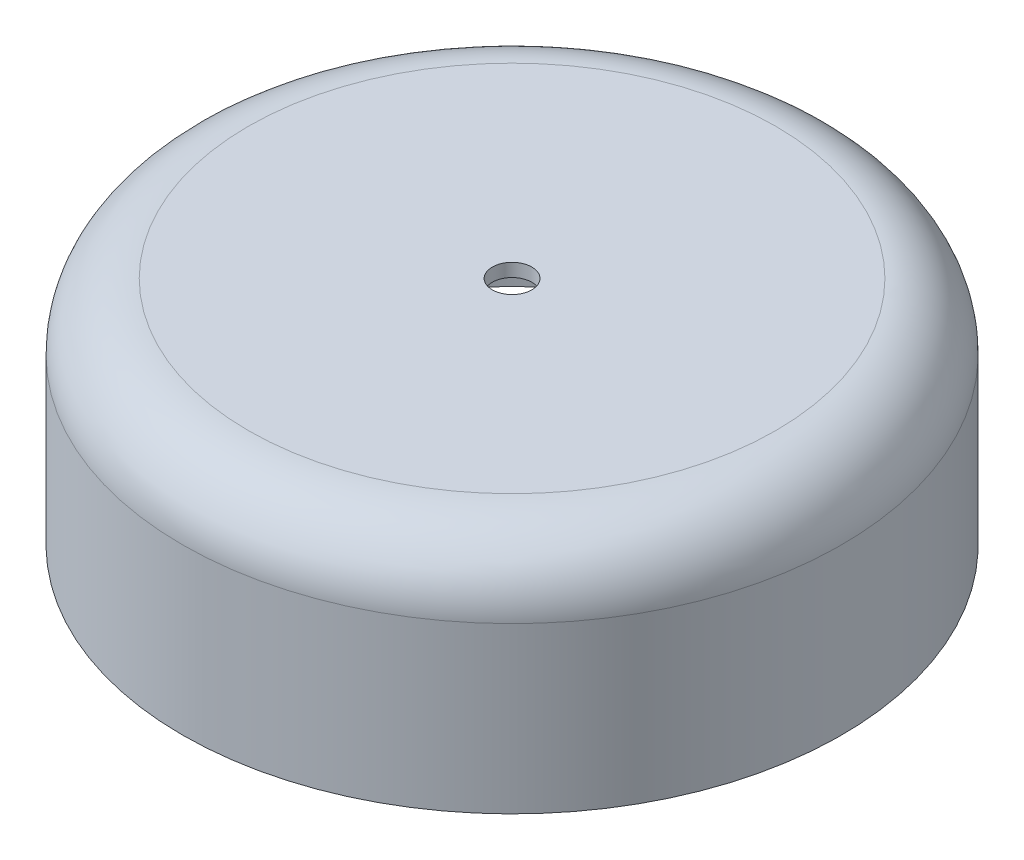
ISO-10303-21;
HEADER;
FILE_DESCRIPTION(('STEP AP214'),'2;1');
FILE_NAME('part.step','',(''),(''),'','','');
FILE_SCHEMA(('AUTOMOTIVE_DESIGN { 1 0 10303 214 1 1 1 1 }'));
ENDSEC;
DATA;
#1=APPLICATION_CONTEXT('core data for automotive mechanical design processes');
#2=APPLICATION_PROTOCOL_DEFINITION('international standard','automotive_design',2000,#1);
#3=PRODUCT_CONTEXT('',#1,'mechanical');
#4=PRODUCT('Part','Part','',(#3));
#5=PRODUCT_RELATED_PRODUCT_CATEGORY('part','',(#4));
#6=PRODUCT_DEFINITION_FORMATION('','',#4);
#7=PRODUCT_DEFINITION_CONTEXT('part definition',#1,'design');
#8=PRODUCT_DEFINITION('design','',#6,#7);
#9=PRODUCT_DEFINITION_SHAPE('','',#8);
#10=(LENGTH_UNIT() NAMED_UNIT(*) SI_UNIT(.MILLI.,.METRE.));
#11=(NAMED_UNIT(*) PLANE_ANGLE_UNIT() SI_UNIT($,.RADIAN.));
#12=(NAMED_UNIT(*) SI_UNIT($,.STERADIAN.) SOLID_ANGLE_UNIT());
#13=UNCERTAINTY_MEASURE_WITH_UNIT(LENGTH_MEASURE(1.E-05),#10,'distance_accuracy_value','');
#14=(GEOMETRIC_REPRESENTATION_CONTEXT(3) GLOBAL_UNCERTAINTY_ASSIGNED_CONTEXT((#13)) GLOBAL_UNIT_ASSIGNED_CONTEXT((#10,
#11,#12)) REPRESENTATION_CONTEXT('',''));
#15=CARTESIAN_POINT('',(0.,0.,0.));
#16=DIRECTION('',(0.,0.,1.));
#17=DIRECTION('',(1.,0.,0.));
#18=AXIS2_PLACEMENT_3D('',#15,#16,#17);
#19=CARTESIAN_POINT('',(0.,33.,-7.50267629332377));
#20=DIRECTION('',(0.,1.,0.));
#21=DIRECTION('',(0.,0.,1.));
#22=AXIS2_PLACEMENT_3D('',#19,#20,#21);
#23=PLANE('',#22);
#24=CARTESIAN_POINT('',(0.,33.,-7.50267629332377));
#25=DIRECTION('',(0.,1.,0.));
#26=DIRECTION('',(0.,0.,1.));
#27=AXIS2_PLACEMENT_3D('',#24,#25,#26);
#28=CIRCLE('',#27,3.);
#29=CARTESIAN_POINT('',(0.,33.,-4.50267629332377));
#30=VERTEX_POINT('',#29);
#31=EDGE_CURVE('E136',#30,#30,#28,.T.);
#32=ORIENTED_EDGE('',*,*,#31,.T.);
#33=EDGE_LOOP('',(#32));
#34=FACE_BOUND('',#33,.T.);
#35=DIRECTION('',(0.,0.,-1.));
#36=VECTOR('',#35,1.);
#37=CARTESIAN_POINT('',(-6.00000000000001,33.,6.));
#38=LINE('',#37,#36);
#39=CARTESIAN_POINT('',(-6.00000000000001,33.,10.5));
#40=VERTEX_POINT('',#39);
#41=CARTESIAN_POINT('',(-6.00000000000001,33.,6.));
#42=VERTEX_POINT('',#41);
#43=EDGE_CURVE('E159',#40,#42,#38,.T.);
#44=ORIENTED_EDGE('',*,*,#43,.F.);
#45=DIRECTION('',(-1.,0.,0.));
#46=VECTOR('',#45,1.);
#47=CARTESIAN_POINT('',(5.99999999999999,33.,10.5));
#48=LINE('',#47,#46);
#49=CARTESIAN_POINT('',(5.99999999999999,33.,10.5));
#50=VERTEX_POINT('',#49);
#51=EDGE_CURVE('E147',#50,#40,#48,.T.);
#52=ORIENTED_EDGE('',*,*,#51,.F.);
#53=DIRECTION('',(0.,0.,1.));
#54=VECTOR('',#53,1.);
#55=CARTESIAN_POINT('',(5.99999999999999,33.,6.));
#56=LINE('',#55,#54);
#57=CARTESIAN_POINT('',(5.99999999999999,33.,6.));
#58=VERTEX_POINT('',#57);
#59=EDGE_CURVE('E153',#58,#50,#56,.T.);
#60=ORIENTED_EDGE('',*,*,#59,.F.);
#61=DIRECTION('',(1.,0.,0.));
#62=VECTOR('',#61,1.);
#63=CARTESIAN_POINT('',(5.99999999999999,33.,6.));
#64=LINE('',#63,#62);
#65=EDGE_CURVE('E160',#42,#58,#64,.T.);
#66=ORIENTED_EDGE('',*,*,#65,.F.);
#67=EDGE_LOOP('',(#44,#52,#60,#66));
#68=FACE_BOUND('',#67,.T.);
#69=CARTESIAN_POINT('',(0.,33.,-7.50267629332377));
#70=DIRECTION('',(0.,1.,0.));
#71=DIRECTION('',(0.,0.,1.));
#72=AXIS2_PLACEMENT_3D('',#69,#70,#71);
#73=CIRCLE('',#72,40.);
#74=CARTESIAN_POINT('',(0.,33.,32.4973237066762));
#75=VERTEX_POINT('',#74);
#76=EDGE_CURVE('E128',#75,#75,#73,.T.);
#77=ORIENTED_EDGE('',*,*,#76,.F.);
#78=EDGE_LOOP('',(#77));
#79=FACE_BOUND('',#78,.T.);
#80=DIRECTION('',(0.,0.,-1.));
#81=VECTOR('',#80,1.);
#82=CARTESIAN_POINT('',(-5.99999999999999,33.,-21.5));
#83=LINE('',#82,#81);
#84=CARTESIAN_POINT('',(-6.,33.,-17.));
#85=VERTEX_POINT('',#84);
#86=CARTESIAN_POINT('',(-5.99999999999999,33.,-21.5));
#87=VERTEX_POINT('',#86);
#88=EDGE_CURVE('E127',#85,#87,#83,.T.);
#89=ORIENTED_EDGE('',*,*,#88,.F.);
#90=DIRECTION('',(-1.,0.,0.));
#91=VECTOR('',#90,1.);
#92=CARTESIAN_POINT('',(6.,33.,-17.));
#93=LINE('',#92,#91);
#94=CARTESIAN_POINT('',(6.,33.,-17.));
#95=VERTEX_POINT('',#94);
#96=EDGE_CURVE('E123',#95,#85,#93,.T.);
#97=ORIENTED_EDGE('',*,*,#96,.F.);
#98=DIRECTION('',(0.,0.,1.));
#99=VECTOR('',#98,1.);
#100=CARTESIAN_POINT('',(6.00000000000001,33.,-21.5));
#101=LINE('',#100,#99);
#102=CARTESIAN_POINT('',(6.00000000000001,33.,-21.5));
#103=VERTEX_POINT('',#102);
#104=EDGE_CURVE('E64',#103,#95,#101,.T.);
#105=ORIENTED_EDGE('',*,*,#104,.F.);
#106=DIRECTION('',(1.,0.,0.));
#107=VECTOR('',#106,1.);
#108=CARTESIAN_POINT('',(6.00000000000001,33.,-21.5));
#109=LINE('',#108,#107);
#110=EDGE_CURVE('E57',#87,#103,#109,.T.);
#111=ORIENTED_EDGE('',*,*,#110,.F.);
#112=EDGE_LOOP('',(#89,#97,#105,#111));
#113=FACE_BOUND('',#112,.T.);
#114=ADVANCED_FACE('F41',(#34,#68,#79,#113),#23,.F.);
#115=CARTESIAN_POINT('',(0.,35.,-7.50267629332377));
#116=DIRECTION('',(0.,-1.,0.));
#117=DIRECTION('',(0.,0.,-1.));
#118=AXIS2_PLACEMENT_3D('',#115,#116,#117);
#119=CYLINDRICAL_SURFACE('',#118,50.);
#120=CARTESIAN_POINT('',(0.,25.,-7.50267629332377));
#121=DIRECTION('',(0.,1.,0.));
#122=DIRECTION('',(0.,0.,1.));
#123=AXIS2_PLACEMENT_3D('',#120,#121,#122);
#124=CIRCLE('',#123,50.);
#125=CARTESIAN_POINT('',(0.,25.,42.4973237066762));
#126=VERTEX_POINT('',#125);
#127=EDGE_CURVE('E11',#126,#126,#124,.F.);
#128=ORIENTED_EDGE('',*,*,#127,.T.);
#129=EDGE_LOOP('',(#128));
#130=FACE_BOUND('',#129,.T.);
#131=CARTESIAN_POINT('',(0.,0.,-7.50267629332377));
#132=DIRECTION('',(0.,1.,0.));
#133=DIRECTION('',(0.,0.,1.));
#134=AXIS2_PLACEMENT_3D('',#131,#132,#133);
#135=CIRCLE('',#134,50.);
#136=CARTESIAN_POINT('',(0.,0.,42.4973237066762));
#137=VERTEX_POINT('',#136);
#138=EDGE_CURVE('E175',#137,#137,#135,.T.);
#139=ORIENTED_EDGE('',*,*,#138,.T.);
#140=EDGE_LOOP('',(#139));
#141=FACE_BOUND('',#140,.T.);
#142=ADVANCED_FACE('F196',(#130,#141),#119,.T.);
#143=CARTESIAN_POINT('',(0.,35.,-7.50267629332377));
#144=DIRECTION('',(0.,1.,0.));
#145=DIRECTION('',(0.,0.,1.));
#146=AXIS2_PLACEMENT_3D('',#143,#144,#145);
#147=PLANE('',#146);
#148=CARTESIAN_POINT('',(0.,35.,-7.50267629332377));
#149=DIRECTION('',(0.,1.,0.));
#150=DIRECTION('',(0.,0.,1.));
#151=AXIS2_PLACEMENT_3D('',#148,#149,#150);
#152=CIRCLE('',#151,3.);
#153=CARTESIAN_POINT('',(0.,35.,-4.50267629332377));
#154=VERTEX_POINT('',#153);
#155=EDGE_CURVE('E222',#154,#154,#152,.T.);
#156=ORIENTED_EDGE('',*,*,#155,.F.);
#157=EDGE_LOOP('',(#156));
#158=FACE_BOUND('',#157,.T.);
#159=CARTESIAN_POINT('',(0.,35.,-7.50267629332377));
#160=DIRECTION('',(0.,1.,0.));
#161=DIRECTION('',(0.,0.,1.));
#162=AXIS2_PLACEMENT_3D('',#159,#160,#161);
#163=CIRCLE('',#162,40.);
#164=CARTESIAN_POINT('',(0.,35.,32.4973237066762));
#165=VERTEX_POINT('',#164);
#166=EDGE_CURVE('E47',#165,#165,#163,.T.);
#167=ORIENTED_EDGE('',*,*,#166,.T.);
#168=EDGE_LOOP('',(#167));
#169=FACE_BOUND('',#168,.T.);
#170=ADVANCED_FACE('F179',(#158,#169),#147,.T.);
#171=CARTESIAN_POINT('',(0.,0.,-7.50267629332377));
#172=DIRECTION('',(0.,1.,0.));
#173=DIRECTION('',(0.,0.,1.));
#174=AXIS2_PLACEMENT_3D('',#171,#172,#173);
#175=PLANE('',#174);
#176=CARTESIAN_POINT('',(0.,0.,-7.50267629332377));
#177=DIRECTION('',(0.,1.,0.));
#178=DIRECTION('',(0.,0.,1.));
#179=AXIS2_PLACEMENT_3D('',#176,#177,#178);
#180=CIRCLE('',#179,48.);
#181=CARTESIAN_POINT('',(0.,0.,40.4973237066762));
#182=VERTEX_POINT('',#181);
#183=EDGE_CURVE('E130',#182,#182,#180,.T.);
#184=ORIENTED_EDGE('',*,*,#183,.T.);
#185=EDGE_LOOP('',(#184));
#186=FACE_BOUND('',#185,.T.);
#187=ORIENTED_EDGE('',*,*,#138,.F.);
#188=EDGE_LOOP('',(#187));
#189=FACE_BOUND('',#188,.T.);
#190=ADVANCED_FACE('F184',(#186,#189),#175,.F.);
#191=CARTESIAN_POINT('',(0.,25.,-7.50267629332377));
#192=DIRECTION('',(0.,1.,0.));
#193=DIRECTION('',(0.,0.,1.));
#194=AXIS2_PLACEMENT_3D('',#191,#192,#193);
#195=TOROIDAL_SURFACE('',#194,40.,10.);
#196=ORIENTED_EDGE('',*,*,#127,.F.);
#197=EDGE_LOOP('',(#196));
#198=FACE_BOUND('',#197,.T.);
#199=ORIENTED_EDGE('',*,*,#166,.F.);
#200=EDGE_LOOP('',(#199));
#201=FACE_BOUND('',#200,.T.);
#202=ADVANCED_FACE('F43',(#198,#201),#195,.T.);
#203=CARTESIAN_POINT('',(0.,35.,-7.50267629332377));
#204=DIRECTION('',(0.,-1.,0.));
#205=DIRECTION('',(0.,0.,-1.));
#206=AXIS2_PLACEMENT_3D('',#203,#204,#205);
#207=CYLINDRICAL_SURFACE('',#206,48.);
#208=CARTESIAN_POINT('',(0.,25.,-7.50267629332377));
#209=DIRECTION('',(0.,-1.,0.));
#210=DIRECTION('',(0.,0.,-1.));
#211=AXIS2_PLACEMENT_3D('',#208,#209,#210);
#212=CIRCLE('',#211,48.);
#213=CARTESIAN_POINT('',(0.,25.,-55.5026762933238));
#214=VERTEX_POINT('',#213);
#215=EDGE_CURVE('E168',#214,#214,#212,.T.);
#216=ORIENTED_EDGE('',*,*,#215,.F.);
#217=EDGE_LOOP('',(#216));
#218=FACE_BOUND('',#217,.T.);
#219=ORIENTED_EDGE('',*,*,#183,.F.);
#220=EDGE_LOOP('',(#219));
#221=FACE_BOUND('',#220,.T.);
#222=ADVANCED_FACE('F181',(#218,#221),#207,.F.);
#223=CARTESIAN_POINT('',(0.,25.,-7.50267629332377));
#224=DIRECTION('',(0.,1.,0.));
#225=DIRECTION('',(0.,0.,1.));
#226=AXIS2_PLACEMENT_3D('',#223,#224,#225);
#227=TOROIDAL_SURFACE('',#226,40.,8.);
#228=ORIENTED_EDGE('',*,*,#215,.T.);
#229=EDGE_LOOP('',(#228));
#230=FACE_BOUND('',#229,.T.);
#231=ORIENTED_EDGE('',*,*,#76,.T.);
#232=EDGE_LOOP('',(#231));
#233=FACE_BOUND('',#232,.T.);
#234=ADVANCED_FACE('F192',(#230,#233),#227,.F.);
#235=CARTESIAN_POINT('',(-6.00000000000001,26.5,6.));
#236=DIRECTION('',(1.,0.,0.));
#237=DIRECTION('',(0.,0.,-1.));
#238=AXIS2_PLACEMENT_3D('',#235,#236,#237);
#239=PLANE('',#238);
#240=ORIENTED_EDGE('',*,*,#43,.T.);
#241=DIRECTION('',(0.,1.,0.));
#242=VECTOR('',#241,1.);
#243=CARTESIAN_POINT('',(-6.00000000000001,26.5,6.));
#244=LINE('',#243,#242);
#245=CARTESIAN_POINT('',(-6.00000000000001,26.5,6.));
#246=VERTEX_POINT('',#245);
#247=EDGE_CURVE('E137',#246,#42,#244,.T.);
#248=ORIENTED_EDGE('',*,*,#247,.F.);
#249=DIRECTION('',(0.,0.,-1.));
#250=VECTOR('',#249,1.);
#251=CARTESIAN_POINT('',(-6.00000000000001,26.5,6.));
#252=LINE('',#251,#250);
#253=CARTESIAN_POINT('',(-6.00000000000001,26.5,10.5));
#254=VERTEX_POINT('',#253);
#255=EDGE_CURVE('E152',#254,#246,#252,.T.);
#256=ORIENTED_EDGE('',*,*,#255,.F.);
#257=DIRECTION('',(0.,1.,0.));
#258=VECTOR('',#257,1.);
#259=CARTESIAN_POINT('',(-6.00000000000001,26.5,10.5));
#260=LINE('',#259,#258);
#261=EDGE_CURVE('E148',#254,#40,#260,.T.);
#262=ORIENTED_EDGE('',*,*,#261,.T.);
#263=EDGE_LOOP('',(#240,#248,#256,#262));
#264=FACE_BOUND('',#263,.T.);
#265=ADVANCED_FACE('F213',(#264),#239,.F.);
#266=CARTESIAN_POINT('',(5.99999999999999,26.5,6.));
#267=DIRECTION('',(0.,0.,1.));
#268=DIRECTION('',(1.,0.,0.));
#269=AXIS2_PLACEMENT_3D('',#266,#267,#268);
#270=PLANE('',#269);
#271=ORIENTED_EDGE('',*,*,#65,.T.);
#272=DIRECTION('',(0.,1.,0.));
#273=VECTOR('',#272,1.);
#274=CARTESIAN_POINT('',(5.99999999999999,26.5,6.));
#275=LINE('',#274,#273);
#276=CARTESIAN_POINT('',(5.99999999999999,26.5,6.));
#277=VERTEX_POINT('',#276);
#278=EDGE_CURVE('E139',#277,#58,#275,.T.);
#279=ORIENTED_EDGE('',*,*,#278,.F.);
#280=DIRECTION('',(1.,0.,0.));
#281=VECTOR('',#280,1.);
#282=CARTESIAN_POINT('',(5.99999999999999,26.5,6.));
#283=LINE('',#282,#281);
#284=EDGE_CURVE('E167',#246,#277,#283,.T.);
#285=ORIENTED_EDGE('',*,*,#284,.F.);
#286=ORIENTED_EDGE('',*,*,#247,.T.);
#287=EDGE_LOOP('',(#271,#279,#285,#286));
#288=FACE_BOUND('',#287,.T.);
#289=ADVANCED_FACE('F254',(#288),#270,.F.);
#290=CARTESIAN_POINT('',(5.99999999999999,26.5,6.));
#291=DIRECTION('',(-1.,0.,0.));
#292=DIRECTION('',(0.,0.,1.));
#293=AXIS2_PLACEMENT_3D('',#290,#291,#292);
#294=PLANE('',#293);
#295=ORIENTED_EDGE('',*,*,#59,.T.);
#296=DIRECTION('',(0.,1.,0.));
#297=VECTOR('',#296,1.);
#298=CARTESIAN_POINT('',(5.99999999999999,26.5,10.5));
#299=LINE('',#298,#297);
#300=CARTESIAN_POINT('',(5.99999999999999,26.5,10.5));
#301=VERTEX_POINT('',#300);
#302=EDGE_CURVE('E141',#301,#50,#299,.T.);
#303=ORIENTED_EDGE('',*,*,#302,.F.);
#304=DIRECTION('',(0.,0.,1.));
#305=VECTOR('',#304,1.);
#306=CARTESIAN_POINT('',(5.99999999999999,26.5,6.));
#307=LINE('',#306,#305);
#308=EDGE_CURVE('E163',#277,#301,#307,.T.);
#309=ORIENTED_EDGE('',*,*,#308,.F.);
#310=ORIENTED_EDGE('',*,*,#278,.T.);
#311=EDGE_LOOP('',(#295,#303,#309,#310));
#312=FACE_BOUND('',#311,.T.);
#313=ADVANCED_FACE('F259',(#312),#294,.F.);
#314=CARTESIAN_POINT('',(5.99999999999999,26.5,10.5));
#315=DIRECTION('',(0.,0.,-1.));
#316=DIRECTION('',(-1.,0.,0.));
#317=AXIS2_PLACEMENT_3D('',#314,#315,#316);
#318=PLANE('',#317);
#319=ORIENTED_EDGE('',*,*,#51,.T.);
#320=ORIENTED_EDGE('',*,*,#261,.F.);
#321=DIRECTION('',(-1.,0.,0.));
#322=VECTOR('',#321,1.);
#323=CARTESIAN_POINT('',(5.99999999999999,26.5,10.5));
#324=LINE('',#323,#322);
#325=EDGE_CURVE('E149',#301,#254,#324,.T.);
#326=ORIENTED_EDGE('',*,*,#325,.F.);
#327=ORIENTED_EDGE('',*,*,#302,.T.);
#328=EDGE_LOOP('',(#319,#320,#326,#327));
#329=FACE_BOUND('',#328,.T.);
#330=ADVANCED_FACE('F263',(#329),#318,.F.);
#331=CARTESIAN_POINT('',(0.,26.5,0.));
#332=DIRECTION('',(0.,-1.,0.));
#333=DIRECTION('',(0.,0.,-1.));
#334=AXIS2_PLACEMENT_3D('',#331,#332,#333);
#335=PLANE('',#334);
#336=ORIENTED_EDGE('',*,*,#255,.T.);
#337=ORIENTED_EDGE('',*,*,#284,.T.);
#338=ORIENTED_EDGE('',*,*,#308,.T.);
#339=ORIENTED_EDGE('',*,*,#325,.T.);
#340=EDGE_LOOP('',(#336,#337,#338,#339));
#341=FACE_BOUND('',#340,.T.);
#342=ADVANCED_FACE('F252',(#341),#335,.T.);
#343=CARTESIAN_POINT('',(-5.99999999999999,26.5,-21.5));
#344=DIRECTION('',(1.,0.,0.));
#345=DIRECTION('',(0.,0.,-1.));
#346=AXIS2_PLACEMENT_3D('',#343,#344,#345);
#347=PLANE('',#346);
#348=ORIENTED_EDGE('',*,*,#88,.T.);
#349=DIRECTION('',(0.,1.,0.));
#350=VECTOR('',#349,1.);
#351=CARTESIAN_POINT('',(-5.99999999999999,26.5,-21.5));
#352=LINE('',#351,#350);
#353=CARTESIAN_POINT('',(-5.99999999999999,26.5,-21.5));
#354=VERTEX_POINT('',#353);
#355=EDGE_CURVE('E110',#354,#87,#352,.T.);
#356=ORIENTED_EDGE('',*,*,#355,.F.);
#357=DIRECTION('',(0.,0.,-1.));
#358=VECTOR('',#357,1.);
#359=CARTESIAN_POINT('',(-5.99999999999999,26.5,-21.5));
#360=LINE('',#359,#358);
#361=CARTESIAN_POINT('',(-6.,26.5,-17.));
#362=VERTEX_POINT('',#361);
#363=EDGE_CURVE('E111',#362,#354,#360,.T.);
#364=ORIENTED_EDGE('',*,*,#363,.F.);
#365=DIRECTION('',(0.,1.,0.));
#366=VECTOR('',#365,1.);
#367=CARTESIAN_POINT('',(-6.,26.5,-17.));
#368=LINE('',#367,#366);
#369=EDGE_CURVE('E230',#362,#85,#368,.T.);
#370=ORIENTED_EDGE('',*,*,#369,.T.);
#371=EDGE_LOOP('',(#348,#356,#364,#370));
#372=FACE_BOUND('',#371,.T.);
#373=ADVANCED_FACE('F124',(#372),#347,.F.);
#374=CARTESIAN_POINT('',(6.00000000000001,26.5,-21.5));
#375=DIRECTION('',(0.,0.,1.));
#376=DIRECTION('',(1.,0.,0.));
#377=AXIS2_PLACEMENT_3D('',#374,#375,#376);
#378=PLANE('',#377);
#379=ORIENTED_EDGE('',*,*,#110,.T.);
#380=DIRECTION('',(0.,1.,0.));
#381=VECTOR('',#380,1.);
#382=CARTESIAN_POINT('',(6.00000000000001,26.5,-21.5));
#383=LINE('',#382,#381);
#384=CARTESIAN_POINT('',(6.00000000000001,26.5,-21.5));
#385=VERTEX_POINT('',#384);
#386=EDGE_CURVE('E109',#385,#103,#383,.T.);
#387=ORIENTED_EDGE('',*,*,#386,.F.);
#388=DIRECTION('',(1.,0.,0.));
#389=VECTOR('',#388,1.);
#390=CARTESIAN_POINT('',(6.00000000000001,26.5,-21.5));
#391=LINE('',#390,#389);
#392=EDGE_CURVE('E103',#354,#385,#391,.T.);
#393=ORIENTED_EDGE('',*,*,#392,.F.);
#394=ORIENTED_EDGE('',*,*,#355,.T.);
#395=EDGE_LOOP('',(#379,#387,#393,#394));
#396=FACE_BOUND('',#395,.T.);
#397=ADVANCED_FACE('F104',(#396),#378,.F.);
#398=CARTESIAN_POINT('',(6.00000000000001,26.5,-21.5));
#399=DIRECTION('',(-1.,0.,0.));
#400=DIRECTION('',(0.,0.,1.));
#401=AXIS2_PLACEMENT_3D('',#398,#399,#400);
#402=PLANE('',#401);
#403=ORIENTED_EDGE('',*,*,#104,.T.);
#404=DIRECTION('',(0.,1.,0.));
#405=VECTOR('',#404,1.);
#406=CARTESIAN_POINT('',(6.,26.5,-17.));
#407=LINE('',#406,#405);
#408=CARTESIAN_POINT('',(6.,26.5,-17.));
#409=VERTEX_POINT('',#408);
#410=EDGE_CURVE('E135',#409,#95,#407,.T.);
#411=ORIENTED_EDGE('',*,*,#410,.F.);
#412=DIRECTION('',(0.,0.,1.));
#413=VECTOR('',#412,1.);
#414=CARTESIAN_POINT('',(6.00000000000001,26.5,-21.5));
#415=LINE('',#414,#413);
#416=EDGE_CURVE('E114',#385,#409,#415,.T.);
#417=ORIENTED_EDGE('',*,*,#416,.F.);
#418=ORIENTED_EDGE('',*,*,#386,.T.);
#419=EDGE_LOOP('',(#403,#411,#417,#418));
#420=FACE_BOUND('',#419,.T.);
#421=ADVANCED_FACE('F239',(#420),#402,.F.);
#422=CARTESIAN_POINT('',(6.,26.5,-17.));
#423=DIRECTION('',(0.,0.,-1.));
#424=DIRECTION('',(-1.,0.,0.));
#425=AXIS2_PLACEMENT_3D('',#422,#423,#424);
#426=PLANE('',#425);
#427=ORIENTED_EDGE('',*,*,#96,.T.);
#428=ORIENTED_EDGE('',*,*,#369,.F.);
#429=DIRECTION('',(-1.,0.,0.));
#430=VECTOR('',#429,1.);
#431=CARTESIAN_POINT('',(6.,26.5,-17.));
#432=LINE('',#431,#430);
#433=EDGE_CURVE('E118',#409,#362,#432,.T.);
#434=ORIENTED_EDGE('',*,*,#433,.F.);
#435=ORIENTED_EDGE('',*,*,#410,.T.);
#436=EDGE_LOOP('',(#427,#428,#434,#435));
#437=FACE_BOUND('',#436,.T.);
#438=ADVANCED_FACE('F240',(#437),#426,.F.);
#439=CARTESIAN_POINT('',(0.,26.5,0.));
#440=DIRECTION('',(0.,-1.,0.));
#441=DIRECTION('',(0.,0.,-1.));
#442=AXIS2_PLACEMENT_3D('',#439,#440,#441);
#443=PLANE('',#442);
#444=ORIENTED_EDGE('',*,*,#363,.T.);
#445=ORIENTED_EDGE('',*,*,#392,.T.);
#446=ORIENTED_EDGE('',*,*,#416,.T.);
#447=ORIENTED_EDGE('',*,*,#433,.T.);
#448=EDGE_LOOP('',(#444,#445,#446,#447));
#449=FACE_BOUND('',#448,.T.);
#450=ADVANCED_FACE('F116',(#449),#443,.T.);
#451=CARTESIAN_POINT('',(0.,0.,-7.50267629332377));
#452=DIRECTION('',(0.,1.,0.));
#453=DIRECTION('',(0.,0.,1.));
#454=AXIS2_PLACEMENT_3D('',#451,#452,#453);
#455=CYLINDRICAL_SURFACE('',#454,3.);
#456=ORIENTED_EDGE('',*,*,#155,.T.);
#457=EDGE_LOOP('',(#456));
#458=FACE_BOUND('',#457,.T.);
#459=ORIENTED_EDGE('',*,*,#31,.F.);
#460=EDGE_LOOP('',(#459));
#461=FACE_BOUND('',#460,.T.);
#462=ADVANCED_FACE('F315',(#458,#461),#455,.F.);
#463=CLOSED_SHELL('',(#114,#142,#170,#190,#202,#222,#234,#265,#289,#313,#330,#342,#373,#397,
#421,#438,#450,#462));
#464=MANIFOLD_SOLID_BREP('B2',#463);
#465=ADVANCED_BREP_SHAPE_REPRESENTATION('',(#18,#464),#14);
#466=SHAPE_DEFINITION_REPRESENTATION(#9,#465);
ENDSEC;
END-ISO-10303-21;
